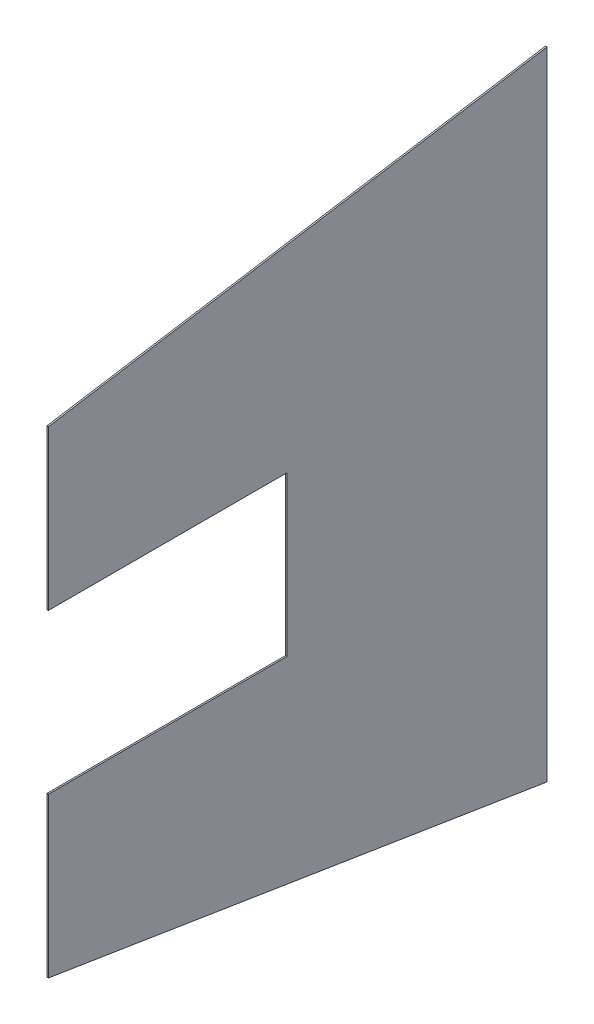
ISO-10303-21;
HEADER;
FILE_DESCRIPTION(('STEP AP214'),'2;1');
FILE_NAME('part.step','',(''),(''),'','','');
FILE_SCHEMA(('AUTOMOTIVE_DESIGN { 1 0 10303 214 1 1 1 1 }'));
ENDSEC;
DATA;
#1=APPLICATION_CONTEXT('core data for automotive mechanical design processes');
#2=APPLICATION_PROTOCOL_DEFINITION('international standard','automotive_design',2000,#1);
#3=PRODUCT_CONTEXT('',#1,'mechanical');
#4=PRODUCT('Part','Part','',(#3));
#5=PRODUCT_RELATED_PRODUCT_CATEGORY('part','',(#4));
#6=PRODUCT_DEFINITION_FORMATION('','',#4);
#7=PRODUCT_DEFINITION_CONTEXT('part definition',#1,'design');
#8=PRODUCT_DEFINITION('design','',#6,#7);
#9=PRODUCT_DEFINITION_SHAPE('','',#8);
#10=(LENGTH_UNIT() NAMED_UNIT(*) SI_UNIT(.MILLI.,.METRE.));
#11=(NAMED_UNIT(*) PLANE_ANGLE_UNIT() SI_UNIT($,.RADIAN.));
#12=(NAMED_UNIT(*) SI_UNIT($,.STERADIAN.) SOLID_ANGLE_UNIT());
#13=UNCERTAINTY_MEASURE_WITH_UNIT(LENGTH_MEASURE(1.E-05),#10,'distance_accuracy_value','');
#14=(GEOMETRIC_REPRESENTATION_CONTEXT(3) GLOBAL_UNCERTAINTY_ASSIGNED_CONTEXT((#13)) GLOBAL_UNIT_ASSIGNED_CONTEXT((#10,
#11,#12)) REPRESENTATION_CONTEXT('',''));
#15=CARTESIAN_POINT('',(0.,0.,0.));
#16=DIRECTION('',(0.,0.,1.));
#17=DIRECTION('',(1.,0.,0.));
#18=AXIS2_PLACEMENT_3D('',#15,#16,#17);
#19=CARTESIAN_POINT('',(0.,0.,0.));
#20=DIRECTION('',(1.,0.,0.));
#21=DIRECTION('',(0.,0.,-1.));
#22=AXIS2_PLACEMENT_3D('',#19,#20,#21);
#23=PLANE('',#22);
#24=DIRECTION('',(0.,1.,0.));
#25=VECTOR('',#24,1.);
#26=CARTESIAN_POINT('',(0.,-165.1,539.75));
#27=LINE('',#26,#25);
#28=CARTESIAN_POINT('',(0.,-165.1,539.75));
#29=VERTEX_POINT('',#28);
#30=CARTESIAN_POINT('',(0.,165.1,539.75));
#31=VERTEX_POINT('',#30);
#32=EDGE_CURVE('E143',#29,#31,#27,.T.);
#33=ORIENTED_EDGE('',*,*,#32,.T.);
#34=DIRECTION('',(0.,0.,1.));
#35=VECTOR('',#34,1.);
#36=CARTESIAN_POINT('',(0.,165.1,539.75));
#37=LINE('',#36,#35);
#38=CARTESIAN_POINT('',(0.,165.1,1035.05));
#39=VERTEX_POINT('',#38);
#40=EDGE_CURVE('E138',#31,#39,#37,.T.);
#41=ORIENTED_EDGE('',*,*,#40,.T.);
#42=DIRECTION('',(0.,1.,0.));
#43=VECTOR('',#42,1.);
#44=CARTESIAN_POINT('',(0.,495.3,1035.05));
#45=LINE('',#44,#43);
#46=CARTESIAN_POINT('',(0.,495.300000000003,1035.05));
#47=VERTEX_POINT('',#46);
#48=EDGE_CURVE('E134',#47,#39,#45,.F.);
#49=ORIENTED_EDGE('',*,*,#48,.F.);
#50=DIRECTION('',(0.,-0.157517910379392,0.987516130455452));
#51=VECTOR('',#50,1.);
#52=CARTESIAN_POINT('',(0.,660.4,0.));
#53=LINE('',#52,#51);
#54=CARTESIAN_POINT('',(0.,660.4,0.));
#55=VERTEX_POINT('',#54);
#56=EDGE_CURVE('E126',#55,#47,#53,.T.);
#57=ORIENTED_EDGE('',*,*,#56,.F.);
#58=DIRECTION('',(0.,1.,0.));
#59=VECTOR('',#58,1.);
#60=CARTESIAN_POINT('',(0.,-660.4,0.));
#61=LINE('',#60,#59);
#62=CARTESIAN_POINT('',(0.,-660.399999999999,-3.60822483003176E-13));
#63=VERTEX_POINT('',#62);
#64=EDGE_CURVE('E120',#63,#55,#61,.T.);
#65=ORIENTED_EDGE('',*,*,#64,.F.);
#66=DIRECTION('',(0.,-0.157517910379392,-0.987516130455452));
#67=VECTOR('',#66,1.);
#68=CARTESIAN_POINT('',(0.,-495.3,1035.05));
#69=LINE('',#68,#67);
#70=CARTESIAN_POINT('',(0.,-495.3,1035.05));
#71=VERTEX_POINT('',#70);
#72=EDGE_CURVE('E95',#71,#63,#69,.T.);
#73=ORIENTED_EDGE('',*,*,#72,.F.);
#74=DIRECTION('',(0.,1.,0.));
#75=VECTOR('',#74,1.);
#76=CARTESIAN_POINT('',(0.,495.3,1035.05));
#77=LINE('',#76,#75);
#78=CARTESIAN_POINT('',(0.,-165.1,1035.05));
#79=VERTEX_POINT('',#78);
#80=EDGE_CURVE('E108',#79,#71,#77,.F.);
#81=ORIENTED_EDGE('',*,*,#80,.F.);
#82=DIRECTION('',(0.,0.,-1.));
#83=VECTOR('',#82,1.);
#84=CARTESIAN_POINT('',(0.,-165.1,1035.05));
#85=LINE('',#84,#83);
#86=EDGE_CURVE('E36',#79,#29,#85,.T.);
#87=ORIENTED_EDGE('',*,*,#86,.T.);
#88=EDGE_LOOP('',(#33,#41,#49,#57,#65,#73,#81,#87));
#89=FACE_BOUND('',#88,.T.);
#90=ADVANCED_FACE('F33',(#89),#23,.F.);
#91=CARTESIAN_POINT('',(3.175,-165.1,1035.05));
#92=DIRECTION('',(0.,-1.,0.));
#93=DIRECTION('',(0.,0.,-1.));
#94=AXIS2_PLACEMENT_3D('',#91,#92,#93);
#95=PLANE('',#94);
#96=DIRECTION('',(1.,0.,0.));
#97=VECTOR('',#96,1.);
#98=CARTESIAN_POINT('',(0.,-165.1,1035.05));
#99=LINE('',#98,#97);
#100=CARTESIAN_POINT('',(3.175,-165.1,1035.05));
#101=VERTEX_POINT('',#100);
#102=EDGE_CURVE('E102',#101,#79,#99,.F.);
#103=ORIENTED_EDGE('',*,*,#102,.F.);
#104=DIRECTION('',(0.,0.,-1.));
#105=VECTOR('',#104,1.);
#106=CARTESIAN_POINT('',(3.175,-165.1,0.));
#107=LINE('',#106,#105);
#108=CARTESIAN_POINT('',(3.175,-165.1,539.75));
#109=VERTEX_POINT('',#108);
#110=EDGE_CURVE('E145',#109,#101,#107,.F.);
#111=ORIENTED_EDGE('',*,*,#110,.F.);
#112=DIRECTION('',(-1.,0.,0.));
#113=VECTOR('',#112,1.);
#114=CARTESIAN_POINT('',(3.175,-165.1,539.75));
#115=LINE('',#114,#113);
#116=EDGE_CURVE('E105',#109,#29,#115,.T.);
#117=ORIENTED_EDGE('',*,*,#116,.T.);
#118=ORIENTED_EDGE('',*,*,#86,.F.);
#119=EDGE_LOOP('',(#103,#111,#117,#118));
#120=FACE_BOUND('',#119,.T.);
#121=ADVANCED_FACE('F100',(#120),#95,.F.);
#122=CARTESIAN_POINT('',(0.,495.3,1035.05));
#123=DIRECTION('',(0.,0.,1.));
#124=DIRECTION('',(1.,0.,0.));
#125=AXIS2_PLACEMENT_3D('',#122,#123,#124);
#126=PLANE('',#125);
#127=DIRECTION('',(1.,0.,0.));
#128=VECTOR('',#127,1.);
#129=CARTESIAN_POINT('',(0.,-495.3,1035.05));
#130=LINE('',#129,#128);
#131=CARTESIAN_POINT('',(3.175,-495.3,1035.05));
#132=VERTEX_POINT('',#131);
#133=EDGE_CURVE('E118',#132,#71,#130,.F.);
#134=ORIENTED_EDGE('',*,*,#133,.F.);
#135=DIRECTION('',(0.,1.,0.));
#136=VECTOR('',#135,1.);
#137=CARTESIAN_POINT('',(3.175,0.,1035.05));
#138=LINE('',#137,#136);
#139=EDGE_CURVE('E114',#101,#132,#138,.F.);
#140=ORIENTED_EDGE('',*,*,#139,.F.);
#141=ORIENTED_EDGE('',*,*,#102,.T.);
#142=ORIENTED_EDGE('',*,*,#80,.T.);
#143=EDGE_LOOP('',(#134,#140,#141,#142));
#144=FACE_BOUND('',#143,.T.);
#145=ADVANCED_FACE('F112',(#144),#126,.T.);
#146=CARTESIAN_POINT('',(0.,-495.3,1035.05));
#147=DIRECTION('',(0.,-0.987516130455452,0.157517910379392));
#148=DIRECTION('',(0.,-0.157517910379392,-0.987516130455452));
#149=AXIS2_PLACEMENT_3D('',#146,#147,#148);
#150=PLANE('',#149);
#151=DIRECTION('',(0.,-0.157517910379397,-0.987516130455451));
#152=VECTOR('',#151,1.);
#153=CARTESIAN_POINT('',(3.175,-495.3,1035.05));
#154=LINE('',#153,#152);
#155=CARTESIAN_POINT('',(3.175,-660.399999999997,-6.38378239159465E-13));
#156=VERTEX_POINT('',#155);
#157=EDGE_CURVE('E148',#132,#156,#154,.T.);
#158=ORIENTED_EDGE('',*,*,#157,.F.);
#159=ORIENTED_EDGE('',*,*,#133,.T.);
#160=ORIENTED_EDGE('',*,*,#72,.T.);
#161=DIRECTION('',(-1.,0.,0.));
#162=VECTOR('',#161,1.);
#163=CARTESIAN_POINT('',(0.,-660.4,0.));
#164=LINE('',#163,#162);
#165=EDGE_CURVE('E123',#156,#63,#164,.T.);
#166=ORIENTED_EDGE('',*,*,#165,.F.);
#167=EDGE_LOOP('',(#158,#159,#160,#166));
#168=FACE_BOUND('',#167,.T.);
#169=ADVANCED_FACE('F189',(#168),#150,.T.);
#170=CARTESIAN_POINT('',(0.,-660.4,0.));
#171=DIRECTION('',(0.,0.,-1.));
#172=DIRECTION('',(-1.,0.,0.));
#173=AXIS2_PLACEMENT_3D('',#170,#171,#172);
#174=PLANE('',#173);
#175=DIRECTION('',(0.,1.,0.));
#176=VECTOR('',#175,1.);
#177=CARTESIAN_POINT('',(3.175,0.,0.));
#178=LINE('',#177,#176);
#179=CARTESIAN_POINT('',(3.175,660.4,0.));
#180=VERTEX_POINT('',#179);
#181=EDGE_CURVE('E151',#156,#180,#178,.T.);
#182=ORIENTED_EDGE('',*,*,#181,.F.);
#183=ORIENTED_EDGE('',*,*,#165,.T.);
#184=ORIENTED_EDGE('',*,*,#64,.T.);
#185=DIRECTION('',(1.,0.,0.));
#186=VECTOR('',#185,1.);
#187=CARTESIAN_POINT('',(0.,660.4,0.));
#188=LINE('',#187,#186);
#189=EDGE_CURVE('E128',#180,#55,#188,.F.);
#190=ORIENTED_EDGE('',*,*,#189,.F.);
#191=EDGE_LOOP('',(#182,#183,#184,#190));
#192=FACE_BOUND('',#191,.T.);
#193=ADVANCED_FACE('F185',(#192),#174,.T.);
#194=CARTESIAN_POINT('',(0.,660.4,0.));
#195=DIRECTION('',(0.,0.987516130455452,0.157517910379392));
#196=DIRECTION('',(0.,-0.157517910379392,0.987516130455452));
#197=AXIS2_PLACEMENT_3D('',#194,#195,#196);
#198=PLANE('',#197);
#199=DIRECTION('',(0.,-0.157517910379397,0.987516130455451));
#200=VECTOR('',#199,1.);
#201=CARTESIAN_POINT('',(3.175,660.4,0.));
#202=LINE('',#201,#200);
#203=CARTESIAN_POINT('',(3.175,495.300000000003,1035.05));
#204=VERTEX_POINT('',#203);
#205=EDGE_CURVE('E154',#180,#204,#202,.T.);
#206=ORIENTED_EDGE('',*,*,#205,.F.);
#207=ORIENTED_EDGE('',*,*,#189,.T.);
#208=ORIENTED_EDGE('',*,*,#56,.T.);
#209=DIRECTION('',(1.,0.,0.));
#210=VECTOR('',#209,1.);
#211=CARTESIAN_POINT('',(0.,495.3,1035.05));
#212=LINE('',#211,#210);
#213=EDGE_CURVE('E131',#204,#47,#212,.F.);
#214=ORIENTED_EDGE('',*,*,#213,.F.);
#215=EDGE_LOOP('',(#206,#207,#208,#214));
#216=FACE_BOUND('',#215,.T.);
#217=ADVANCED_FACE('F182',(#216),#198,.T.);
#218=CARTESIAN_POINT('',(0.,495.3,1035.05));
#219=DIRECTION('',(0.,0.,1.));
#220=DIRECTION('',(1.,0.,0.));
#221=AXIS2_PLACEMENT_3D('',#218,#219,#220);
#222=PLANE('',#221);
#223=ORIENTED_EDGE('',*,*,#213,.T.);
#224=ORIENTED_EDGE('',*,*,#48,.T.);
#225=DIRECTION('',(1.,0.,0.));
#226=VECTOR('',#225,1.);
#227=CARTESIAN_POINT('',(3.175,165.1,1035.05));
#228=LINE('',#227,#226);
#229=CARTESIAN_POINT('',(3.175,165.1,1035.05));
#230=VERTEX_POINT('',#229);
#231=EDGE_CURVE('E136',#39,#230,#228,.T.);
#232=ORIENTED_EDGE('',*,*,#231,.T.);
#233=DIRECTION('',(0.,1.,0.));
#234=VECTOR('',#233,1.);
#235=CARTESIAN_POINT('',(3.175,0.,1035.05));
#236=LINE('',#235,#234);
#237=EDGE_CURVE('E157',#204,#230,#236,.F.);
#238=ORIENTED_EDGE('',*,*,#237,.F.);
#239=EDGE_LOOP('',(#223,#224,#232,#238));
#240=FACE_BOUND('',#239,.T.);
#241=ADVANCED_FACE('F167',(#240),#222,.T.);
#242=CARTESIAN_POINT('',(3.175,165.1,539.75));
#243=DIRECTION('',(0.,1.,0.));
#244=DIRECTION('',(0.,0.,1.));
#245=AXIS2_PLACEMENT_3D('',#242,#243,#244);
#246=PLANE('',#245);
#247=DIRECTION('',(-1.,0.,0.));
#248=VECTOR('',#247,1.);
#249=CARTESIAN_POINT('',(3.175,165.1,539.75));
#250=LINE('',#249,#248);
#251=CARTESIAN_POINT('',(3.175,165.1,539.75));
#252=VERTEX_POINT('',#251);
#253=EDGE_CURVE('E51',#31,#252,#250,.F.);
#254=ORIENTED_EDGE('',*,*,#253,.T.);
#255=DIRECTION('',(0.,0.,-1.));
#256=VECTOR('',#255,1.);
#257=CARTESIAN_POINT('',(3.175,165.1,0.));
#258=LINE('',#257,#256);
#259=EDGE_CURVE('E42',#230,#252,#258,.T.);
#260=ORIENTED_EDGE('',*,*,#259,.F.);
#261=ORIENTED_EDGE('',*,*,#231,.F.);
#262=ORIENTED_EDGE('',*,*,#40,.F.);
#263=EDGE_LOOP('',(#254,#260,#261,#262));
#264=FACE_BOUND('',#263,.T.);
#265=ADVANCED_FACE('F165',(#264),#246,.F.);
#266=CARTESIAN_POINT('',(3.175,-165.1,539.75));
#267=DIRECTION('',(0.,0.,-1.));
#268=DIRECTION('',(-1.,0.,0.));
#269=AXIS2_PLACEMENT_3D('',#266,#267,#268);
#270=PLANE('',#269);
#271=ORIENTED_EDGE('',*,*,#116,.F.);
#272=DIRECTION('',(0.,1.,0.));
#273=VECTOR('',#272,1.);
#274=CARTESIAN_POINT('',(3.175,0.,539.75));
#275=LINE('',#274,#273);
#276=EDGE_CURVE('E11',#252,#109,#275,.F.);
#277=ORIENTED_EDGE('',*,*,#276,.F.);
#278=ORIENTED_EDGE('',*,*,#253,.F.);
#279=ORIENTED_EDGE('',*,*,#32,.F.);
#280=EDGE_LOOP('',(#271,#277,#278,#279));
#281=FACE_BOUND('',#280,.T.);
#282=ADVANCED_FACE('F170',(#281),#270,.F.);
#283=CARTESIAN_POINT('',(3.175,0.,0.));
#284=DIRECTION('',(1.,0.,0.));
#285=DIRECTION('',(0.,0.,-1.));
#286=AXIS2_PLACEMENT_3D('',#283,#284,#285);
#287=PLANE('',#286);
#288=ORIENTED_EDGE('',*,*,#259,.T.);
#289=ORIENTED_EDGE('',*,*,#276,.T.);
#290=ORIENTED_EDGE('',*,*,#110,.T.);
#291=ORIENTED_EDGE('',*,*,#139,.T.);
#292=ORIENTED_EDGE('',*,*,#157,.T.);
#293=ORIENTED_EDGE('',*,*,#181,.T.);
#294=ORIENTED_EDGE('',*,*,#205,.T.);
#295=ORIENTED_EDGE('',*,*,#237,.T.);
#296=EDGE_LOOP('',(#288,#289,#290,#291,#292,#293,#294,#295));
#297=FACE_BOUND('',#296,.T.);
#298=ADVANCED_FACE('F162',(#297),#287,.T.);
#299=CLOSED_SHELL('',(#90,#121,#145,#169,#193,#217,#241,#265,#282,#298));
#300=MANIFOLD_SOLID_BREP('B2',#299);
#301=ADVANCED_BREP_SHAPE_REPRESENTATION('',(#18,#300),#14);
#302=SHAPE_DEFINITION_REPRESENTATION(#9,#301);
ENDSEC;
END-ISO-10303-21;
